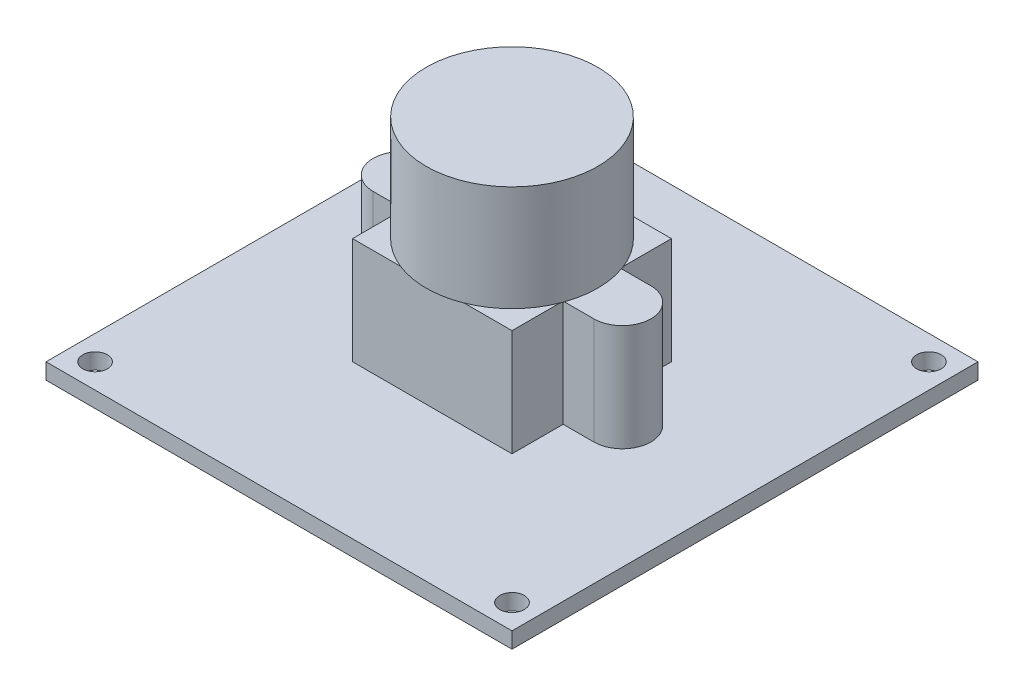
ISO-10303-21;
HEADER;
FILE_DESCRIPTION(('STEP AP214'),'2;1');
FILE_NAME('part.step','',(''),(''),'','','');
FILE_SCHEMA(('AUTOMOTIVE_DESIGN { 1 0 10303 214 1 1 1 1 }'));
ENDSEC;
DATA;
#1=APPLICATION_CONTEXT('core data for automotive mechanical design processes');
#2=APPLICATION_PROTOCOL_DEFINITION('international standard','automotive_design',2000,#1);
#3=PRODUCT_CONTEXT('',#1,'mechanical');
#4=PRODUCT('Part','Part','',(#3));
#5=PRODUCT_RELATED_PRODUCT_CATEGORY('part','',(#4));
#6=PRODUCT_DEFINITION_FORMATION('','',#4);
#7=PRODUCT_DEFINITION_CONTEXT('part definition',#1,'design');
#8=PRODUCT_DEFINITION('design','',#6,#7);
#9=PRODUCT_DEFINITION_SHAPE('','',#8);
#10=(LENGTH_UNIT() NAMED_UNIT(*) SI_UNIT(.MILLI.,.METRE.));
#11=(NAMED_UNIT(*) PLANE_ANGLE_UNIT() SI_UNIT($,.RADIAN.));
#12=(NAMED_UNIT(*) SI_UNIT($,.STERADIAN.) SOLID_ANGLE_UNIT());
#13=UNCERTAINTY_MEASURE_WITH_UNIT(LENGTH_MEASURE(1.E-05),#10,'distance_accuracy_value','');
#14=(GEOMETRIC_REPRESENTATION_CONTEXT(3) GLOBAL_UNCERTAINTY_ASSIGNED_CONTEXT((#13)) GLOBAL_UNIT_ASSIGNED_CONTEXT((#10,
#11,#12)) REPRESENTATION_CONTEXT('',''));
#15=CARTESIAN_POINT('',(0.,0.,0.));
#16=DIRECTION('',(0.,0.,1.));
#17=DIRECTION('',(1.,0.,0.));
#18=AXIS2_PLACEMENT_3D('',#15,#16,#17);
#19=CARTESIAN_POINT('',(-4.38653846154582,10.,5.00576923076923));
#20=DIRECTION('',(0.,1.,0.));
#21=DIRECTION('',(0.,0.,1.));
#22=AXIS2_PLACEMENT_3D('',#19,#20,#21);
#23=PLANE('',#22);
#24=CARTESIAN_POINT('',(4.61346153845418,10.,5.00576923076923));
#25=DIRECTION('',(0.,1.,0.));
#26=DIRECTION('',(0.,0.,1.));
#27=AXIS2_PLACEMENT_3D('',#24,#25,#26);
#28=CIRCLE('',#27,7.);
#29=CARTESIAN_POINT('',(7.2115377498075,10.,11.5057692307692));
#30=VERTEX_POINT('',#29);
#31=CARTESIAN_POINT('',(11.1134615384542,10.,7.60384544212255));
#32=VERTEX_POINT('',#31);
#33=EDGE_CURVE('E232',#30,#32,#28,.T.);
#34=ORIENTED_EDGE('',*,*,#33,.F.);
#35=DIRECTION('',(1.,0.,0.));
#36=VECTOR('',#35,1.);
#37=CARTESIAN_POINT('',(-1.88653846154583,10.,11.5057692307692));
#38=LINE('',#37,#36);
#39=CARTESIAN_POINT('',(11.1134615384542,10.,11.5057692307692));
#40=VERTEX_POINT('',#39);
#41=EDGE_CURVE('E217',#30,#40,#38,.T.);
#42=ORIENTED_EDGE('',*,*,#41,.T.);
#43=DIRECTION('',(0.,0.,-1.));
#44=VECTOR('',#43,1.);
#45=CARTESIAN_POINT('',(11.1134615384542,10.,11.5057692307692));
#46=LINE('',#45,#44);
#47=EDGE_CURVE('E308',#40,#32,#46,.T.);
#48=ORIENTED_EDGE('',*,*,#47,.T.);
#49=EDGE_LOOP('',(#34,#42,#48));
#50=FACE_BOUND('',#49,.T.);
#51=ADVANCED_FACE('F52',(#50),#23,.T.);
#52=CARTESIAN_POINT('',(11.2150175404706,10.,7.3337422444104));
#53=VERTEX_POINT('',#52);
#54=CARTESIAN_POINT('',(11.2150175404706,10.,2.67779621712805));
#55=VERTEX_POINT('',#54);
#56=EDGE_CURVE('E13',#53,#55,#28,.T.);
#57=ORIENTED_EDGE('',*,*,#56,.F.);
#58=DIRECTION('',(1.,0.,0.));
#59=VECTOR('',#58,1.);
#60=CARTESIAN_POINT('',(11.1134615384542,10.,7.3337422444104));
#61=LINE('',#60,#59);
#62=CARTESIAN_POINT('',(13.6134615384542,10.,7.3337422444104));
#63=VERTEX_POINT('',#62);
#64=EDGE_CURVE('E312',#53,#63,#61,.T.);
#65=ORIENTED_EDGE('',*,*,#64,.T.);
#66=CARTESIAN_POINT('',(13.6134615384542,10.,5.00576923076922));
#67=DIRECTION('',(0.,1.,0.));
#68=DIRECTION('',(0.,0.,1.));
#69=AXIS2_PLACEMENT_3D('',#66,#67,#68);
#70=CIRCLE('',#69,2.32797301364118);
#71=CARTESIAN_POINT('',(13.6134615384542,10.,2.67779621712805));
#72=VERTEX_POINT('',#71);
#73=EDGE_CURVE('E317',#63,#72,#70,.T.);
#74=ORIENTED_EDGE('',*,*,#73,.T.);
#75=DIRECTION('',(-1.,0.,0.));
#76=VECTOR('',#75,1.);
#77=CARTESIAN_POINT('',(11.1134615384542,10.,2.67779621712805));
#78=LINE('',#77,#76);
#79=EDGE_CURVE('E320',#72,#55,#78,.T.);
#80=ORIENTED_EDGE('',*,*,#79,.T.);
#81=EDGE_LOOP('',(#57,#65,#74,#80));
#82=FACE_BOUND('',#81,.T.);
#83=ADVANCED_FACE('F503',(#82),#23,.T.);
#84=CARTESIAN_POINT('',(11.1134615384542,10.,2.40769301941591));
#85=VERTEX_POINT('',#84);
#86=CARTESIAN_POINT('',(7.2115377498075,10.,-1.49423076923078));
#87=VERTEX_POINT('',#86);
#88=EDGE_CURVE('E62',#85,#87,#28,.T.);
#89=ORIENTED_EDGE('',*,*,#88,.F.);
#90=DIRECTION('',(0.,0.,-1.));
#91=VECTOR('',#90,1.);
#92=CARTESIAN_POINT('',(11.1134615384542,10.,2.67779621712805));
#93=LINE('',#92,#91);
#94=CARTESIAN_POINT('',(11.1134615384542,10.,-1.49423076923078));
#95=VERTEX_POINT('',#94);
#96=EDGE_CURVE('E361',#85,#95,#93,.T.);
#97=ORIENTED_EDGE('',*,*,#96,.T.);
#98=DIRECTION('',(-1.,0.,0.));
#99=VECTOR('',#98,1.);
#100=CARTESIAN_POINT('',(-1.88653846154583,10.,-1.49423076923078));
#101=LINE('',#100,#99);
#102=EDGE_CURVE('E613',#95,#87,#101,.T.);
#103=ORIENTED_EDGE('',*,*,#102,.T.);
#104=EDGE_LOOP('',(#89,#97,#103));
#105=FACE_BOUND('',#104,.T.);
#106=ADVANCED_FACE('F509',(#105),#23,.T.);
#107=CARTESIAN_POINT('',(2.01538532710086,10.,-1.49423076923078));
#108=VERTEX_POINT('',#107);
#109=CARTESIAN_POINT('',(-1.88653846154583,10.,2.40769301941591));
#110=VERTEX_POINT('',#109);
#111=EDGE_CURVE('E242',#108,#110,#28,.T.);
#112=ORIENTED_EDGE('',*,*,#111,.F.);
#113=CARTESIAN_POINT('',(-1.88653846154583,10.,-1.49423076923078));
#114=VERTEX_POINT('',#113);
#115=EDGE_CURVE('E608',#108,#114,#101,.T.);
#116=ORIENTED_EDGE('',*,*,#115,.T.);
#117=DIRECTION('',(0.,0.,1.));
#118=VECTOR('',#117,1.);
#119=CARTESIAN_POINT('',(-1.88653846154583,10.,2.67779621712805));
#120=LINE('',#119,#118);
#121=EDGE_CURVE('E296',#114,#110,#120,.T.);
#122=ORIENTED_EDGE('',*,*,#121,.T.);
#123=EDGE_LOOP('',(#112,#116,#122));
#124=FACE_BOUND('',#123,.T.);
#125=ADVANCED_FACE('F525',(#124),#23,.T.);
#126=CARTESIAN_POINT('',(-1.9880944635622,10.,2.67779621712805));
#127=VERTEX_POINT('',#126);
#128=CARTESIAN_POINT('',(-1.9880944635622,10.,7.3337422444104));
#129=VERTEX_POINT('',#128);
#130=EDGE_CURVE('E238',#127,#129,#28,.T.);
#131=ORIENTED_EDGE('',*,*,#130,.F.);
#132=DIRECTION('',(-1.,0.,0.));
#133=VECTOR('',#132,1.);
#134=CARTESIAN_POINT('',(-4.38653846154583,10.,2.67779621712805));
#135=LINE('',#134,#133);
#136=CARTESIAN_POINT('',(-4.38653846154583,10.,2.67779621712805));
#137=VERTEX_POINT('',#136);
#138=EDGE_CURVE('E289',#127,#137,#135,.T.);
#139=ORIENTED_EDGE('',*,*,#138,.T.);
#140=CARTESIAN_POINT('',(-4.38653846154582,10.,5.00576923076923));
#141=DIRECTION('',(0.,1.,0.));
#142=DIRECTION('',(0.,0.,1.));
#143=AXIS2_PLACEMENT_3D('',#140,#141,#142);
#144=CIRCLE('',#143,2.32797301364118);
#145=CARTESIAN_POINT('',(-4.38653846154582,10.,7.33374224441041));
#146=VERTEX_POINT('',#145);
#147=EDGE_CURVE('E288',#137,#146,#144,.T.);
#148=ORIENTED_EDGE('',*,*,#147,.T.);
#149=DIRECTION('',(1.,0.,0.));
#150=VECTOR('',#149,1.);
#151=CARTESIAN_POINT('',(-4.38653846154582,10.,7.33374224441041));
#152=LINE('',#151,#150);
#153=EDGE_CURVE('E300',#146,#129,#152,.T.);
#154=ORIENTED_EDGE('',*,*,#153,.T.);
#155=EDGE_LOOP('',(#131,#139,#148,#154));
#156=FACE_BOUND('',#155,.T.);
#157=ADVANCED_FACE('F515',(#156),#23,.T.);
#158=CARTESIAN_POINT('',(0.,1.3,0.));
#159=DIRECTION('',(0.,1.,0.));
#160=DIRECTION('',(0.,0.,1.));
#161=AXIS2_PLACEMENT_3D('',#158,#159,#160);
#162=PLANE('',#161);
#163=CARTESIAN_POINT('',(21.6134615384542,1.3,22.0057692307663));
#164=DIRECTION('',(0.,1.,0.));
#165=DIRECTION('',(0.,0.,1.));
#166=AXIS2_PLACEMENT_3D('',#163,#164,#165);
#167=CIRCLE('',#166,1.);
#168=CARTESIAN_POINT('',(21.6134615384542,1.3,23.0057692307663));
#169=VERTEX_POINT('',#168);
#170=EDGE_CURVE('E414',#169,#169,#167,.T.);
#171=ORIENTED_EDGE('',*,*,#170,.F.);
#172=EDGE_LOOP('',(#171));
#173=FACE_BOUND('',#172,.T.);
#174=CARTESIAN_POINT('',(-12.3865384615458,1.3,-11.9942307692338));
#175=DIRECTION('',(0.,1.,0.));
#176=DIRECTION('',(0.,0.,1.));
#177=AXIS2_PLACEMENT_3D('',#174,#175,#176);
#178=CIRCLE('',#177,1.);
#179=CARTESIAN_POINT('',(-12.3865384615458,1.3,-10.9942307692338));
#180=VERTEX_POINT('',#179);
#181=EDGE_CURVE('E430',#180,#180,#178,.T.);
#182=ORIENTED_EDGE('',*,*,#181,.F.);
#183=EDGE_LOOP('',(#182));
#184=FACE_BOUND('',#183,.T.);
#185=DIRECTION('',(0.,0.,1.));
#186=VECTOR('',#185,1.);
#187=CARTESIAN_POINT('',(-14.3865384615458,1.3,-13.9942307692308));
#188=LINE('',#187,#186);
#189=CARTESIAN_POINT('',(-14.3865384615458,1.3,-13.9942307692308));
#190=VERTEX_POINT('',#189);
#191=CARTESIAN_POINT('',(-14.3865384615458,1.3,24.0057692307692));
#192=VERTEX_POINT('',#191);
#193=EDGE_CURVE('E438',#190,#192,#188,.T.);
#194=ORIENTED_EDGE('',*,*,#193,.T.);
#195=DIRECTION('',(1.,0.,0.));
#196=VECTOR('',#195,1.);
#197=CARTESIAN_POINT('',(-14.3865384615458,1.3,24.0057692307692));
#198=LINE('',#197,#196);
#199=CARTESIAN_POINT('',(23.6134615384542,1.3,24.0057692307692));
#200=VERTEX_POINT('',#199);
#201=EDGE_CURVE('E442',#192,#200,#198,.T.);
#202=ORIENTED_EDGE('',*,*,#201,.T.);
#203=DIRECTION('',(0.,0.,-1.));
#204=VECTOR('',#203,1.);
#205=CARTESIAN_POINT('',(23.6134615384542,1.3,-13.9942307692308));
#206=LINE('',#205,#204);
#207=CARTESIAN_POINT('',(23.6134615384542,1.3,-13.9942307692308));
#208=VERTEX_POINT('',#207);
#209=EDGE_CURVE('E446',#200,#208,#206,.T.);
#210=ORIENTED_EDGE('',*,*,#209,.T.);
#211=DIRECTION('',(-1.,0.,0.));
#212=VECTOR('',#211,1.);
#213=CARTESIAN_POINT('',(-14.3865384615458,1.3,-13.9942307692308));
#214=LINE('',#213,#212);
#215=EDGE_CURVE('E449',#208,#190,#214,.T.);
#216=ORIENTED_EDGE('',*,*,#215,.T.);
#217=EDGE_LOOP('',(#194,#202,#210,#216));
#218=FACE_BOUND('',#217,.T.);
#219=CARTESIAN_POINT('',(21.6134615384542,1.3,-11.9942307692338));
#220=DIRECTION('',(0.,1.,0.));
#221=DIRECTION('',(0.,0.,1.));
#222=AXIS2_PLACEMENT_3D('',#219,#220,#221);
#223=CIRCLE('',#222,1.);
#224=CARTESIAN_POINT('',(21.6134615384542,1.3,-10.9942307692338));
#225=VERTEX_POINT('',#224);
#226=EDGE_CURVE('E422',#225,#225,#223,.T.);
#227=ORIENTED_EDGE('',*,*,#226,.F.);
#228=EDGE_LOOP('',(#227));
#229=FACE_BOUND('',#228,.T.);
#230=CARTESIAN_POINT('',(-12.3865384615458,1.3,22.0057692307662));
#231=DIRECTION('',(0.,1.,0.));
#232=DIRECTION('',(0.,0.,1.));
#233=AXIS2_PLACEMENT_3D('',#230,#231,#232);
#234=CIRCLE('',#233,1.);
#235=CARTESIAN_POINT('',(-12.3865384615458,1.3,23.0057692307662));
#236=VERTEX_POINT('',#235);
#237=EDGE_CURVE('E406',#236,#236,#234,.T.);
#238=ORIENTED_EDGE('',*,*,#237,.F.);
#239=EDGE_LOOP('',(#238));
#240=FACE_BOUND('',#239,.T.);
#241=DIRECTION('',(-1.,0.,0.));
#242=VECTOR('',#241,1.);
#243=CARTESIAN_POINT('',(-1.88653846154583,1.3,-1.49423076923078));
#244=LINE('',#243,#242);
#245=CARTESIAN_POINT('',(11.1134615384542,1.3,-1.49423076923078));
#246=VERTEX_POINT('',#245);
#247=CARTESIAN_POINT('',(-1.88653846154583,1.3,-1.49423076923078));
#248=VERTEX_POINT('',#247);
#249=EDGE_CURVE('E327',#246,#248,#244,.T.);
#250=ORIENTED_EDGE('',*,*,#249,.F.);
#251=DIRECTION('',(0.,0.,-1.));
#252=VECTOR('',#251,1.);
#253=CARTESIAN_POINT('',(11.1134615384542,1.3,2.67779621712805));
#254=LINE('',#253,#252);
#255=CARTESIAN_POINT('',(11.1134615384542,1.3,2.67779621712805));
#256=VERTEX_POINT('',#255);
#257=EDGE_CURVE('E254',#256,#246,#254,.T.);
#258=ORIENTED_EDGE('',*,*,#257,.F.);
#259=DIRECTION('',(-1.,0.,0.));
#260=VECTOR('',#259,1.);
#261=CARTESIAN_POINT('',(11.1134615384542,1.3,2.67779621712805));
#262=LINE('',#261,#260);
#263=CARTESIAN_POINT('',(13.6134615384542,1.3,2.67779621712804));
#264=VERTEX_POINT('',#263);
#265=EDGE_CURVE('E358',#264,#256,#262,.T.);
#266=ORIENTED_EDGE('',*,*,#265,.F.);
#267=CARTESIAN_POINT('',(13.6134615384542,1.3,5.00576923076922));
#268=DIRECTION('',(0.,1.,0.));
#269=DIRECTION('',(0.,0.,1.));
#270=AXIS2_PLACEMENT_3D('',#267,#268,#269);
#271=CIRCLE('',#270,2.32797301364118);
#272=CARTESIAN_POINT('',(13.6134615384542,1.3,7.3337422444104));
#273=VERTEX_POINT('',#272);
#274=EDGE_CURVE('E354',#273,#264,#271,.T.);
#275=ORIENTED_EDGE('',*,*,#274,.F.);
#276=DIRECTION('',(1.,0.,0.));
#277=VECTOR('',#276,1.);
#278=CARTESIAN_POINT('',(11.1134615384542,1.3,7.3337422444104));
#279=LINE('',#278,#277);
#280=CARTESIAN_POINT('',(11.1134615384542,1.3,7.3337422444104));
#281=VERTEX_POINT('',#280);
#282=EDGE_CURVE('E351',#281,#273,#279,.T.);
#283=ORIENTED_EDGE('',*,*,#282,.F.);
#284=DIRECTION('',(0.,0.,-1.));
#285=VECTOR('',#284,1.);
#286=CARTESIAN_POINT('',(11.1134615384542,1.3,11.5057692307692));
#287=LINE('',#286,#285);
#288=CARTESIAN_POINT('',(11.1134615384542,1.3,11.5057692307692));
#289=VERTEX_POINT('',#288);
#290=EDGE_CURVE('E348',#289,#281,#287,.T.);
#291=ORIENTED_EDGE('',*,*,#290,.F.);
#292=DIRECTION('',(1.,0.,0.));
#293=VECTOR('',#292,1.);
#294=CARTESIAN_POINT('',(-1.88653846154583,1.3,11.5057692307692));
#295=LINE('',#294,#293);
#296=CARTESIAN_POINT('',(-1.88653846154583,1.3,11.5057692307692));
#297=VERTEX_POINT('',#296);
#298=EDGE_CURVE('E345',#297,#289,#295,.T.);
#299=ORIENTED_EDGE('',*,*,#298,.F.);
#300=DIRECTION('',(0.,0.,1.));
#301=VECTOR('',#300,1.);
#302=CARTESIAN_POINT('',(-1.88653846154583,1.3,11.5057692307692));
#303=LINE('',#302,#301);
#304=CARTESIAN_POINT('',(-1.88653846154583,1.3,7.3337422444104));
#305=VERTEX_POINT('',#304);
#306=EDGE_CURVE('E342',#305,#297,#303,.T.);
#307=ORIENTED_EDGE('',*,*,#306,.F.);
#308=DIRECTION('',(1.,0.,0.));
#309=VECTOR('',#308,1.);
#310=CARTESIAN_POINT('',(-4.38653846154582,1.3,7.33374224441041));
#311=LINE('',#310,#309);
#312=CARTESIAN_POINT('',(-4.38653846154582,1.3,7.33374224441041));
#313=VERTEX_POINT('',#312);
#314=EDGE_CURVE('E339',#313,#305,#311,.T.);
#315=ORIENTED_EDGE('',*,*,#314,.F.);
#316=CARTESIAN_POINT('',(-4.38653846154582,1.3,5.00576923076923));
#317=DIRECTION('',(0.,1.,0.));
#318=DIRECTION('',(0.,0.,1.));
#319=AXIS2_PLACEMENT_3D('',#316,#317,#318);
#320=CIRCLE('',#319,2.32797301364118);
#321=CARTESIAN_POINT('',(-4.38653846154583,1.3,2.67779621712805));
#322=VERTEX_POINT('',#321);
#323=EDGE_CURVE('E336',#322,#313,#320,.T.);
#324=ORIENTED_EDGE('',*,*,#323,.F.);
#325=DIRECTION('',(-1.,0.,0.));
#326=VECTOR('',#325,1.);
#327=CARTESIAN_POINT('',(-4.38653846154583,1.3,2.67779621712805));
#328=LINE('',#327,#326);
#329=CARTESIAN_POINT('',(-1.88653846154583,1.3,2.67779621712805));
#330=VERTEX_POINT('',#329);
#331=EDGE_CURVE('E333',#330,#322,#328,.T.);
#332=ORIENTED_EDGE('',*,*,#331,.F.);
#333=DIRECTION('',(0.,0.,1.));
#334=VECTOR('',#333,1.);
#335=CARTESIAN_POINT('',(-1.88653846154583,1.3,2.67779621712805));
#336=LINE('',#335,#334);
#337=EDGE_CURVE('E330',#248,#330,#336,.T.);
#338=ORIENTED_EDGE('',*,*,#337,.F.);
#339=EDGE_LOOP('',(#250,#258,#266,#275,#283,#291,#299,#307,#315,#324,#332,#338));
#340=FACE_BOUND('',#339,.T.);
#341=ADVANCED_FACE('F493',(#173,#184,#218,#229,#240,#340),#162,.T.);
#342=CARTESIAN_POINT('',(0.,0.,0.));
#343=DIRECTION('',(0.,1.,0.));
#344=DIRECTION('',(0.,0.,1.));
#345=AXIS2_PLACEMENT_3D('',#342,#343,#344);
#346=PLANE('',#345);
#347=DIRECTION('',(0.,0.,1.));
#348=VECTOR('',#347,1.);
#349=CARTESIAN_POINT('',(-14.3865384615458,0.,-13.9942307692308));
#350=LINE('',#349,#348);
#351=CARTESIAN_POINT('',(-14.3865384615458,0.,-13.9942307692308));
#352=VERTEX_POINT('',#351);
#353=CARTESIAN_POINT('',(-14.3865384615458,0.,24.0057692307692));
#354=VERTEX_POINT('',#353);
#355=EDGE_CURVE('E434',#352,#354,#350,.T.);
#356=ORIENTED_EDGE('',*,*,#355,.F.);
#357=DIRECTION('',(-1.,0.,0.));
#358=VECTOR('',#357,1.);
#359=CARTESIAN_POINT('',(-14.3865384615458,0.,-13.9942307692308));
#360=LINE('',#359,#358);
#361=CARTESIAN_POINT('',(23.6134615384542,0.,-13.9942307692308));
#362=VERTEX_POINT('',#361);
#363=EDGE_CURVE('E443',#362,#352,#360,.T.);
#364=ORIENTED_EDGE('',*,*,#363,.F.);
#365=DIRECTION('',(0.,0.,-1.));
#366=VECTOR('',#365,1.);
#367=CARTESIAN_POINT('',(23.6134615384542,0.,-13.9942307692308));
#368=LINE('',#367,#366);
#369=CARTESIAN_POINT('',(23.6134615384542,0.,24.0057692307692));
#370=VERTEX_POINT('',#369);
#371=EDGE_CURVE('E459',#370,#362,#368,.T.);
#372=ORIENTED_EDGE('',*,*,#371,.F.);
#373=DIRECTION('',(1.,0.,0.));
#374=VECTOR('',#373,1.);
#375=CARTESIAN_POINT('',(-14.3865384615458,0.,24.0057692307692));
#376=LINE('',#375,#374);
#377=EDGE_CURVE('E456',#354,#370,#376,.T.);
#378=ORIENTED_EDGE('',*,*,#377,.F.);
#379=EDGE_LOOP('',(#356,#364,#372,#378));
#380=FACE_BOUND('',#379,.T.);
#381=CARTESIAN_POINT('',(-12.3865384615458,0.,-11.9942307692338));
#382=DIRECTION('',(0.,1.,0.));
#383=DIRECTION('',(0.,0.,1.));
#384=AXIS2_PLACEMENT_3D('',#381,#382,#383);
#385=CIRCLE('',#384,1.);
#386=CARTESIAN_POINT('',(-12.3865384615458,0.,-10.9942307692338));
#387=VERTEX_POINT('',#386);
#388=EDGE_CURVE('E426',#387,#387,#385,.T.);
#389=ORIENTED_EDGE('',*,*,#388,.T.);
#390=EDGE_LOOP('',(#389));
#391=FACE_BOUND('',#390,.T.);
#392=CARTESIAN_POINT('',(21.6134615384542,0.,-11.9942307692338));
#393=DIRECTION('',(0.,1.,0.));
#394=DIRECTION('',(0.,0.,1.));
#395=AXIS2_PLACEMENT_3D('',#392,#393,#394);
#396=CIRCLE('',#395,1.);
#397=CARTESIAN_POINT('',(21.6134615384542,0.,-10.9942307692338));
#398=VERTEX_POINT('',#397);
#399=EDGE_CURVE('E418',#398,#398,#396,.T.);
#400=ORIENTED_EDGE('',*,*,#399,.T.);
#401=EDGE_LOOP('',(#400));
#402=FACE_BOUND('',#401,.T.);
#403=CARTESIAN_POINT('',(21.6134615384542,0.,22.0057692307663));
#404=DIRECTION('',(0.,1.,0.));
#405=DIRECTION('',(0.,0.,1.));
#406=AXIS2_PLACEMENT_3D('',#403,#404,#405);
#407=CIRCLE('',#406,1.);
#408=CARTESIAN_POINT('',(21.6134615384542,0.,23.0057692307663));
#409=VERTEX_POINT('',#408);
#410=EDGE_CURVE('E410',#409,#409,#407,.T.);
#411=ORIENTED_EDGE('',*,*,#410,.T.);
#412=EDGE_LOOP('',(#411));
#413=FACE_BOUND('',#412,.T.);
#414=CARTESIAN_POINT('',(-12.3865384615458,0.,22.0057692307662));
#415=DIRECTION('',(0.,1.,0.));
#416=DIRECTION('',(0.,0.,1.));
#417=AXIS2_PLACEMENT_3D('',#414,#415,#416);
#418=CIRCLE('',#417,1.);
#419=CARTESIAN_POINT('',(-12.3865384615458,0.,23.0057692307662));
#420=VERTEX_POINT('',#419);
#421=EDGE_CURVE('E405',#420,#420,#418,.T.);
#422=ORIENTED_EDGE('',*,*,#421,.T.);
#423=EDGE_LOOP('',(#422));
#424=FACE_BOUND('',#423,.T.);
#425=ADVANCED_FACE('F483',(#380,#391,#402,#413,#424),#346,.F.);
#426=CARTESIAN_POINT('',(-14.3865384615458,1.3,-13.9942307692308));
#427=DIRECTION('',(1.,0.,0.));
#428=DIRECTION('',(0.,0.,-1.));
#429=AXIS2_PLACEMENT_3D('',#426,#427,#428);
#430=PLANE('',#429);
#431=ORIENTED_EDGE('',*,*,#355,.T.);
#432=DIRECTION('',(0.,-1.,0.));
#433=VECTOR('',#432,1.);
#434=CARTESIAN_POINT('',(-14.3865384615458,1.3,24.0057692307692));
#435=LINE('',#434,#433);
#436=EDGE_CURVE('E56',#192,#354,#435,.T.);
#437=ORIENTED_EDGE('',*,*,#436,.F.);
#438=ORIENTED_EDGE('',*,*,#193,.F.);
#439=DIRECTION('',(0.,-1.,0.));
#440=VECTOR('',#439,1.);
#441=CARTESIAN_POINT('',(-14.3865384615458,1.3,-13.9942307692308));
#442=LINE('',#441,#440);
#443=EDGE_CURVE('E452',#190,#352,#442,.T.);
#444=ORIENTED_EDGE('',*,*,#443,.T.);
#445=EDGE_LOOP('',(#431,#437,#438,#444));
#446=FACE_BOUND('',#445,.T.);
#447=ADVANCED_FACE('F54',(#446),#430,.F.);
#448=CARTESIAN_POINT('',(-14.3865384615458,1.3,24.0057692307692));
#449=DIRECTION('',(0.,0.,-1.));
#450=DIRECTION('',(-1.,0.,0.));
#451=AXIS2_PLACEMENT_3D('',#448,#449,#450);
#452=PLANE('',#451);
#453=ORIENTED_EDGE('',*,*,#377,.T.);
#454=DIRECTION('',(0.,-1.,0.));
#455=VECTOR('',#454,1.);
#456=CARTESIAN_POINT('',(23.6134615384542,1.3,24.0057692307692));
#457=LINE('',#456,#455);
#458=EDGE_CURVE('E244',#200,#370,#457,.T.);
#459=ORIENTED_EDGE('',*,*,#458,.F.);
#460=ORIENTED_EDGE('',*,*,#201,.F.);
#461=ORIENTED_EDGE('',*,*,#436,.T.);
#462=EDGE_LOOP('',(#453,#459,#460,#461));
#463=FACE_BOUND('',#462,.T.);
#464=ADVANCED_FACE('F495',(#463),#452,.F.);
#465=CARTESIAN_POINT('',(23.6134615384542,1.3,-13.9942307692308));
#466=DIRECTION('',(-1.,0.,0.));
#467=DIRECTION('',(0.,0.,1.));
#468=AXIS2_PLACEMENT_3D('',#465,#466,#467);
#469=PLANE('',#468);
#470=ORIENTED_EDGE('',*,*,#371,.T.);
#471=DIRECTION('',(0.,-1.,0.));
#472=VECTOR('',#471,1.);
#473=CARTESIAN_POINT('',(23.6134615384542,1.3,-13.9942307692308));
#474=LINE('',#473,#472);
#475=EDGE_CURVE('E467',#208,#362,#474,.T.);
#476=ORIENTED_EDGE('',*,*,#475,.F.);
#477=ORIENTED_EDGE('',*,*,#209,.F.);
#478=ORIENTED_EDGE('',*,*,#458,.T.);
#479=EDGE_LOOP('',(#470,#476,#477,#478));
#480=FACE_BOUND('',#479,.T.);
#481=ADVANCED_FACE('F477',(#480),#469,.F.);
#482=CARTESIAN_POINT('',(-14.3865384615458,1.3,-13.9942307692308));
#483=DIRECTION('',(0.,0.,1.));
#484=DIRECTION('',(1.,0.,0.));
#485=AXIS2_PLACEMENT_3D('',#482,#483,#484);
#486=PLANE('',#485);
#487=ORIENTED_EDGE('',*,*,#363,.T.);
#488=ORIENTED_EDGE('',*,*,#443,.F.);
#489=ORIENTED_EDGE('',*,*,#215,.F.);
#490=ORIENTED_EDGE('',*,*,#475,.T.);
#491=EDGE_LOOP('',(#487,#488,#489,#490));
#492=FACE_BOUND('',#491,.T.);
#493=ADVANCED_FACE('F487',(#492),#486,.F.);
#494=CARTESIAN_POINT('',(-12.3865384615458,1.3,-11.9942307692338));
#495=DIRECTION('',(0.,-1.,0.));
#496=DIRECTION('',(0.,0.,-1.));
#497=AXIS2_PLACEMENT_3D('',#494,#495,#496);
#498=CYLINDRICAL_SURFACE('',#497,1.);
#499=ORIENTED_EDGE('',*,*,#181,.T.);
#500=EDGE_LOOP('',(#499));
#501=FACE_BOUND('',#500,.T.);
#502=ORIENTED_EDGE('',*,*,#388,.F.);
#503=EDGE_LOOP('',(#502));
#504=FACE_BOUND('',#503,.T.);
#505=ADVANCED_FACE('F717',(#501,#504),#498,.F.);
#506=CARTESIAN_POINT('',(21.6134615384542,1.3,-11.9942307692338));
#507=DIRECTION('',(0.,-1.,0.));
#508=DIRECTION('',(0.,0.,-1.));
#509=AXIS2_PLACEMENT_3D('',#506,#507,#508);
#510=CYLINDRICAL_SURFACE('',#509,1.);
#511=ORIENTED_EDGE('',*,*,#226,.T.);
#512=EDGE_LOOP('',(#511));
#513=FACE_BOUND('',#512,.T.);
#514=ORIENTED_EDGE('',*,*,#399,.F.);
#515=EDGE_LOOP('',(#514));
#516=FACE_BOUND('',#515,.T.);
#517=ADVANCED_FACE('F713',(#513,#516),#510,.F.);
#518=CARTESIAN_POINT('',(21.6134615384542,1.3,22.0057692307663));
#519=DIRECTION('',(0.,-1.,0.));
#520=DIRECTION('',(0.,0.,-1.));
#521=AXIS2_PLACEMENT_3D('',#518,#519,#520);
#522=CYLINDRICAL_SURFACE('',#521,1.);
#523=ORIENTED_EDGE('',*,*,#170,.T.);
#524=EDGE_LOOP('',(#523));
#525=FACE_BOUND('',#524,.T.);
#526=ORIENTED_EDGE('',*,*,#410,.F.);
#527=EDGE_LOOP('',(#526));
#528=FACE_BOUND('',#527,.T.);
#529=ADVANCED_FACE('F709',(#525,#528),#522,.F.);
#530=CARTESIAN_POINT('',(-12.3865384615458,1.3,22.0057692307662));
#531=DIRECTION('',(0.,-1.,0.));
#532=DIRECTION('',(0.,0.,-1.));
#533=AXIS2_PLACEMENT_3D('',#530,#531,#532);
#534=CYLINDRICAL_SURFACE('',#533,1.);
#535=ORIENTED_EDGE('',*,*,#237,.T.);
#536=EDGE_LOOP('',(#535));
#537=FACE_BOUND('',#536,.T.);
#538=ORIENTED_EDGE('',*,*,#421,.F.);
#539=EDGE_LOOP('',(#538));
#540=FACE_BOUND('',#539,.T.);
#541=ADVANCED_FACE('F706',(#537,#540),#534,.F.);
#542=CARTESIAN_POINT('',(11.1134615384542,10.,2.67779621712805));
#543=DIRECTION('',(-1.,0.,0.));
#544=DIRECTION('',(0.,0.,1.));
#545=AXIS2_PLACEMENT_3D('',#542,#543,#544);
#546=PLANE('',#545);
#547=ORIENTED_EDGE('',*,*,#257,.T.);
#548=DIRECTION('',(0.,-1.,0.));
#549=VECTOR('',#548,1.);
#550=CARTESIAN_POINT('',(11.1134615384542,10.,-1.49423076923078));
#551=LINE('',#550,#549);
#552=EDGE_CURVE('E402',#95,#246,#551,.T.);
#553=ORIENTED_EDGE('',*,*,#552,.F.);
#554=ORIENTED_EDGE('',*,*,#96,.F.);
#555=CARTESIAN_POINT('',(11.1134615384542,10.,2.67779621712805));
#556=VERTEX_POINT('',#555);
#557=EDGE_CURVE('E604',#556,#85,#93,.T.);
#558=ORIENTED_EDGE('',*,*,#557,.F.);
#559=DIRECTION('',(0.,-1.,0.));
#560=VECTOR('',#559,1.);
#561=CARTESIAN_POINT('',(11.1134615384542,10.,2.67779621712805));
#562=LINE('',#561,#560);
#563=EDGE_CURVE('E323',#556,#256,#562,.T.);
#564=ORIENTED_EDGE('',*,*,#563,.T.);
#565=EDGE_LOOP('',(#547,#553,#554,#558,#564));
#566=FACE_BOUND('',#565,.T.);
#567=ADVANCED_FACE('F634',(#566),#546,.F.);
#568=CARTESIAN_POINT('',(-1.88653846154583,10.,-1.49423076923078));
#569=DIRECTION('',(0.,0.,1.));
#570=DIRECTION('',(1.,0.,0.));
#571=AXIS2_PLACEMENT_3D('',#568,#569,#570);
#572=PLANE('',#571);
#573=ORIENTED_EDGE('',*,*,#249,.T.);
#574=DIRECTION('',(0.,-1.,0.));
#575=VECTOR('',#574,1.);
#576=CARTESIAN_POINT('',(-1.88653846154583,10.,-1.49423076923078));
#577=LINE('',#576,#575);
#578=EDGE_CURVE('E398',#114,#248,#577,.T.);
#579=ORIENTED_EDGE('',*,*,#578,.F.);
#580=ORIENTED_EDGE('',*,*,#115,.F.);
#581=EDGE_CURVE('E612',#87,#108,#101,.T.);
#582=ORIENTED_EDGE('',*,*,#581,.F.);
#583=ORIENTED_EDGE('',*,*,#102,.F.);
#584=ORIENTED_EDGE('',*,*,#552,.T.);
#585=EDGE_LOOP('',(#573,#579,#580,#582,#583,#584));
#586=FACE_BOUND('',#585,.T.);
#587=ADVANCED_FACE('F625',(#586),#572,.F.);
#588=CARTESIAN_POINT('',(-1.88653846154583,10.,2.67779621712805));
#589=DIRECTION('',(1.,0.,0.));
#590=DIRECTION('',(0.,0.,-1.));
#591=AXIS2_PLACEMENT_3D('',#588,#589,#590);
#592=PLANE('',#591);
#593=ORIENTED_EDGE('',*,*,#337,.T.);
#594=DIRECTION('',(0.,-1.,0.));
#595=VECTOR('',#594,1.);
#596=CARTESIAN_POINT('',(-1.88653846154583,10.,2.67779621712805));
#597=LINE('',#596,#595);
#598=CARTESIAN_POINT('',(-1.88653846154583,10.,2.67779621712805));
#599=VERTEX_POINT('',#598);
#600=EDGE_CURVE('E395',#599,#330,#597,.T.);
#601=ORIENTED_EDGE('',*,*,#600,.F.);
#602=EDGE_CURVE('E281',#110,#599,#120,.T.);
#603=ORIENTED_EDGE('',*,*,#602,.F.);
#604=ORIENTED_EDGE('',*,*,#121,.F.);
#605=ORIENTED_EDGE('',*,*,#578,.T.);
#606=EDGE_LOOP('',(#593,#601,#603,#604,#605));
#607=FACE_BOUND('',#606,.T.);
#608=ADVANCED_FACE('F640',(#607),#592,.F.);
#609=CARTESIAN_POINT('',(-4.38653846154583,10.,2.67779621712805));
#610=DIRECTION('',(0.,0.,1.));
#611=DIRECTION('',(1.,0.,0.));
#612=AXIS2_PLACEMENT_3D('',#609,#610,#611);
#613=PLANE('',#612);
#614=ORIENTED_EDGE('',*,*,#331,.T.);
#615=DIRECTION('',(0.,-1.,0.));
#616=VECTOR('',#615,1.);
#617=CARTESIAN_POINT('',(-4.38653846154583,10.,2.67779621712805));
#618=LINE('',#617,#616);
#619=EDGE_CURVE('E391',#137,#322,#618,.T.);
#620=ORIENTED_EDGE('',*,*,#619,.F.);
#621=ORIENTED_EDGE('',*,*,#138,.F.);
#622=EDGE_CURVE('E283',#599,#127,#135,.T.);
#623=ORIENTED_EDGE('',*,*,#622,.F.);
#624=ORIENTED_EDGE('',*,*,#600,.T.);
#625=EDGE_LOOP('',(#614,#620,#621,#623,#624));
#626=FACE_BOUND('',#625,.T.);
#627=ADVANCED_FACE('F536',(#626),#613,.F.);
#628=CARTESIAN_POINT('',(-4.38653846154582,10.,5.00576923076923));
#629=DIRECTION('',(0.,-1.,0.));
#630=DIRECTION('',(0.,0.,-1.));
#631=AXIS2_PLACEMENT_3D('',#628,#629,#630);
#632=CYLINDRICAL_SURFACE('',#631,2.32797301364118);
#633=ORIENTED_EDGE('',*,*,#323,.T.);
#634=DIRECTION('',(0.,-1.,0.));
#635=VECTOR('',#634,1.);
#636=CARTESIAN_POINT('',(-4.38653846154582,10.,7.33374224441041));
#637=LINE('',#636,#635);
#638=EDGE_CURVE('E387',#146,#313,#637,.T.);
#639=ORIENTED_EDGE('',*,*,#638,.F.);
#640=ORIENTED_EDGE('',*,*,#147,.F.);
#641=ORIENTED_EDGE('',*,*,#619,.T.);
#642=EDGE_LOOP('',(#633,#639,#640,#641));
#643=FACE_BOUND('',#642,.T.);
#644=ADVANCED_FACE('F542',(#643),#632,.T.);
#645=CARTESIAN_POINT('',(-4.38653846154582,10.,7.33374224441041));
#646=DIRECTION('',(0.,0.,-1.));
#647=DIRECTION('',(-1.,0.,0.));
#648=AXIS2_PLACEMENT_3D('',#645,#646,#647);
#649=PLANE('',#648);
#650=ORIENTED_EDGE('',*,*,#314,.T.);
#651=DIRECTION('',(0.,-1.,0.));
#652=VECTOR('',#651,1.);
#653=CARTESIAN_POINT('',(-1.88653846154583,10.,7.3337422444104));
#654=LINE('',#653,#652);
#655=CARTESIAN_POINT('',(-1.88653846154583,10.,7.3337422444104));
#656=VERTEX_POINT('',#655);
#657=EDGE_CURVE('E383',#656,#305,#654,.T.);
#658=ORIENTED_EDGE('',*,*,#657,.F.);
#659=EDGE_CURVE('E294',#129,#656,#152,.T.);
#660=ORIENTED_EDGE('',*,*,#659,.F.);
#661=ORIENTED_EDGE('',*,*,#153,.F.);
#662=ORIENTED_EDGE('',*,*,#638,.T.);
#663=EDGE_LOOP('',(#650,#658,#660,#661,#662));
#664=FACE_BOUND('',#663,.T.);
#665=ADVANCED_FACE('F545',(#664),#649,.F.);
#666=CARTESIAN_POINT('',(-1.88653846154583,10.,11.5057692307692));
#667=DIRECTION('',(1.,0.,0.));
#668=DIRECTION('',(0.,0.,-1.));
#669=AXIS2_PLACEMENT_3D('',#666,#667,#668);
#670=PLANE('',#669);
#671=ORIENTED_EDGE('',*,*,#306,.T.);
#672=DIRECTION('',(0.,-1.,0.));
#673=VECTOR('',#672,1.);
#674=CARTESIAN_POINT('',(-1.88653846154583,10.,11.5057692307692));
#675=LINE('',#674,#673);
#676=CARTESIAN_POINT('',(-1.88653846154583,10.,11.5057692307692));
#677=VERTEX_POINT('',#676);
#678=EDGE_CURVE('E380',#677,#297,#675,.T.);
#679=ORIENTED_EDGE('',*,*,#678,.F.);
#680=DIRECTION('',(0.,0.,1.));
#681=VECTOR('',#680,1.);
#682=CARTESIAN_POINT('',(-1.88653846154583,10.,11.5057692307692));
#683=LINE('',#682,#681);
#684=CARTESIAN_POINT('',(-1.88653846154583,10.,7.60384544212254));
#685=VERTEX_POINT('',#684);
#686=EDGE_CURVE('E209',#685,#677,#683,.T.);
#687=ORIENTED_EDGE('',*,*,#686,.F.);
#688=EDGE_CURVE('E304',#656,#685,#683,.T.);
#689=ORIENTED_EDGE('',*,*,#688,.F.);
#690=ORIENTED_EDGE('',*,*,#657,.T.);
#691=EDGE_LOOP('',(#671,#679,#687,#689,#690));
#692=FACE_BOUND('',#691,.T.);
#693=ADVANCED_FACE('F644',(#692),#670,.F.);
#694=CARTESIAN_POINT('',(-1.88653846154583,10.,11.5057692307692));
#695=DIRECTION('',(0.,0.,-1.));
#696=DIRECTION('',(-1.,0.,0.));
#697=AXIS2_PLACEMENT_3D('',#694,#695,#696);
#698=PLANE('',#697);
#699=ORIENTED_EDGE('',*,*,#298,.T.);
#700=DIRECTION('',(0.,-1.,0.));
#701=VECTOR('',#700,1.);
#702=CARTESIAN_POINT('',(11.1134615384542,10.,11.5057692307692));
#703=LINE('',#702,#701);
#704=EDGE_CURVE('E376',#40,#289,#703,.T.);
#705=ORIENTED_EDGE('',*,*,#704,.F.);
#706=ORIENTED_EDGE('',*,*,#41,.F.);
#707=CARTESIAN_POINT('',(2.01538532710086,10.,11.5057692307692));
#708=VERTEX_POINT('',#707);
#709=EDGE_CURVE('E215',#708,#30,#38,.T.);
#710=ORIENTED_EDGE('',*,*,#709,.F.);
#711=EDGE_CURVE('E203',#677,#708,#38,.T.);
#712=ORIENTED_EDGE('',*,*,#711,.F.);
#713=ORIENTED_EDGE('',*,*,#678,.T.);
#714=EDGE_LOOP('',(#699,#705,#706,#710,#712,#713));
#715=FACE_BOUND('',#714,.T.);
#716=ADVANCED_FACE('F221',(#715),#698,.F.);
#717=CARTESIAN_POINT('',(11.1134615384542,10.,11.5057692307692));
#718=DIRECTION('',(-1.,0.,0.));
#719=DIRECTION('',(0.,0.,1.));
#720=AXIS2_PLACEMENT_3D('',#717,#718,#719);
#721=PLANE('',#720);
#722=ORIENTED_EDGE('',*,*,#290,.T.);
#723=DIRECTION('',(0.,-1.,0.));
#724=VECTOR('',#723,1.);
#725=CARTESIAN_POINT('',(11.1134615384542,10.,7.3337422444104));
#726=LINE('',#725,#724);
#727=CARTESIAN_POINT('',(11.1134615384542,10.,7.3337422444104));
#728=VERTEX_POINT('',#727);
#729=EDGE_CURVE('E372',#728,#281,#726,.T.);
#730=ORIENTED_EDGE('',*,*,#729,.F.);
#731=EDGE_CURVE('E214',#32,#728,#46,.T.);
#732=ORIENTED_EDGE('',*,*,#731,.F.);
#733=ORIENTED_EDGE('',*,*,#47,.F.);
#734=ORIENTED_EDGE('',*,*,#704,.T.);
#735=EDGE_LOOP('',(#722,#730,#732,#733,#734));
#736=FACE_BOUND('',#735,.T.);
#737=ADVANCED_FACE('F680',(#736),#721,.F.);
#738=CARTESIAN_POINT('',(11.1134615384542,10.,7.3337422444104));
#739=DIRECTION('',(0.,0.,-1.));
#740=DIRECTION('',(-1.,0.,0.));
#741=AXIS2_PLACEMENT_3D('',#738,#739,#740);
#742=PLANE('',#741);
#743=ORIENTED_EDGE('',*,*,#282,.T.);
#744=DIRECTION('',(0.,-1.,0.));
#745=VECTOR('',#744,1.);
#746=CARTESIAN_POINT('',(13.6134615384542,10.,7.3337422444104));
#747=LINE('',#746,#745);
#748=EDGE_CURVE('E368',#63,#273,#747,.T.);
#749=ORIENTED_EDGE('',*,*,#748,.F.);
#750=ORIENTED_EDGE('',*,*,#64,.F.);
#751=EDGE_CURVE('E313',#728,#53,#61,.T.);
#752=ORIENTED_EDGE('',*,*,#751,.F.);
#753=ORIENTED_EDGE('',*,*,#729,.T.);
#754=EDGE_LOOP('',(#743,#749,#750,#752,#753));
#755=FACE_BOUND('',#754,.T.);
#756=ADVANCED_FACE('F670',(#755),#742,.F.);
#757=CARTESIAN_POINT('',(13.6134615384542,10.,5.00576923076922));
#758=DIRECTION('',(0.,-1.,0.));
#759=DIRECTION('',(0.,0.,-1.));
#760=AXIS2_PLACEMENT_3D('',#757,#758,#759);
#761=CYLINDRICAL_SURFACE('',#760,2.32797301364118);
#762=ORIENTED_EDGE('',*,*,#274,.T.);
#763=DIRECTION('',(0.,-1.,0.));
#764=VECTOR('',#763,1.);
#765=CARTESIAN_POINT('',(13.6134615384542,10.,2.67779621712805));
#766=LINE('',#765,#764);
#767=EDGE_CURVE('E365',#72,#264,#766,.T.);
#768=ORIENTED_EDGE('',*,*,#767,.F.);
#769=ORIENTED_EDGE('',*,*,#73,.F.);
#770=ORIENTED_EDGE('',*,*,#748,.T.);
#771=EDGE_LOOP('',(#762,#768,#769,#770));
#772=FACE_BOUND('',#771,.T.);
#773=ADVANCED_FACE('F523',(#772),#761,.T.);
#774=CARTESIAN_POINT('',(11.1134615384542,10.,2.67779621712805));
#775=DIRECTION('',(0.,0.,1.));
#776=DIRECTION('',(1.,0.,0.));
#777=AXIS2_PLACEMENT_3D('',#774,#775,#776);
#778=PLANE('',#777);
#779=ORIENTED_EDGE('',*,*,#265,.T.);
#780=ORIENTED_EDGE('',*,*,#563,.F.);
#781=EDGE_CURVE('E71',#55,#556,#78,.T.);
#782=ORIENTED_EDGE('',*,*,#781,.F.);
#783=ORIENTED_EDGE('',*,*,#79,.F.);
#784=ORIENTED_EDGE('',*,*,#767,.T.);
#785=EDGE_LOOP('',(#779,#780,#782,#783,#784));
#786=FACE_BOUND('',#785,.T.);
#787=ADVANCED_FACE('F514',(#786),#778,.F.);
#788=EDGE_CURVE('E207',#685,#708,#28,.T.);
#789=ORIENTED_EDGE('',*,*,#788,.F.);
#790=ORIENTED_EDGE('',*,*,#686,.T.);
#791=ORIENTED_EDGE('',*,*,#711,.T.);
#792=EDGE_LOOP('',(#789,#790,#791));
#793=FACE_BOUND('',#792,.T.);
#794=ADVANCED_FACE('F205',(#793),#23,.T.);
#795=CARTESIAN_POINT('',(4.61346153845418,10.,5.00576923076923));
#796=DIRECTION('',(0.,1.,0.));
#797=DIRECTION('',(0.,0.,1.));
#798=AXIS2_PLACEMENT_3D('',#795,#796,#797);
#799=PLANE('',#798);
#800=EDGE_CURVE('E260',#87,#108,#28,.T.);
#801=ORIENTED_EDGE('',*,*,#800,.F.);
#802=ORIENTED_EDGE('',*,*,#581,.T.);
#803=EDGE_LOOP('',(#801,#802));
#804=FACE_BOUND('',#803,.T.);
#805=ADVANCED_FACE('F513',(#804),#799,.F.);
#806=EDGE_CURVE('E266',#110,#127,#28,.T.);
#807=ORIENTED_EDGE('',*,*,#806,.F.);
#808=ORIENTED_EDGE('',*,*,#602,.T.);
#809=ORIENTED_EDGE('',*,*,#622,.T.);
#810=EDGE_LOOP('',(#807,#808,#809));
#811=FACE_BOUND('',#810,.T.);
#812=ADVANCED_FACE('F280',(#811),#799,.F.);
#813=EDGE_CURVE('E231',#129,#685,#28,.T.);
#814=ORIENTED_EDGE('',*,*,#813,.F.);
#815=ORIENTED_EDGE('',*,*,#659,.T.);
#816=ORIENTED_EDGE('',*,*,#688,.T.);
#817=EDGE_LOOP('',(#814,#815,#816));
#818=FACE_BOUND('',#817,.T.);
#819=ADVANCED_FACE('F645',(#818),#799,.F.);
#820=EDGE_CURVE('E226',#708,#30,#28,.T.);
#821=ORIENTED_EDGE('',*,*,#820,.F.);
#822=ORIENTED_EDGE('',*,*,#709,.T.);
#823=EDGE_LOOP('',(#821,#822));
#824=FACE_BOUND('',#823,.T.);
#825=ADVANCED_FACE('F227',(#824),#799,.F.);
#826=EDGE_CURVE('E64',#32,#53,#28,.T.);
#827=ORIENTED_EDGE('',*,*,#826,.F.);
#828=ORIENTED_EDGE('',*,*,#731,.T.);
#829=ORIENTED_EDGE('',*,*,#751,.T.);
#830=EDGE_LOOP('',(#827,#828,#829));
#831=FACE_BOUND('',#830,.T.);
#832=ADVANCED_FACE('F651',(#831),#799,.F.);
#833=ORIENTED_EDGE('',*,*,#781,.T.);
#834=ORIENTED_EDGE('',*,*,#557,.T.);
#835=EDGE_CURVE('E255',#55,#85,#28,.T.);
#836=ORIENTED_EDGE('',*,*,#835,.F.);
#837=EDGE_LOOP('',(#833,#834,#836));
#838=FACE_BOUND('',#837,.T.);
#839=ADVANCED_FACE('F522',(#838),#799,.F.);
#840=CARTESIAN_POINT('',(4.61346153845418,18.6,5.00576923076923));
#841=DIRECTION('',(0.,-1.,0.));
#842=DIRECTION('',(0.,0.,-1.));
#843=AXIS2_PLACEMENT_3D('',#840,#841,#842);
#844=CYLINDRICAL_SURFACE('',#843,7.);
#845=CARTESIAN_POINT('',(4.61346153845418,18.6,5.00576923076923));
#846=DIRECTION('',(0.,1.,0.));
#847=DIRECTION('',(0.,0.,1.));
#848=AXIS2_PLACEMENT_3D('',#845,#846,#847);
#849=CIRCLE('',#848,7.);
#850=CARTESIAN_POINT('',(4.61346153845418,18.6,12.0057692307692));
#851=VERTEX_POINT('',#850);
#852=EDGE_CURVE('E248',#851,#851,#849,.T.);
#853=ORIENTED_EDGE('',*,*,#852,.F.);
#854=EDGE_LOOP('',(#853));
#855=FACE_BOUND('',#854,.T.);
#856=ORIENTED_EDGE('',*,*,#33,.T.);
#857=ORIENTED_EDGE('',*,*,#826,.T.);
#858=ORIENTED_EDGE('',*,*,#56,.T.);
#859=ORIENTED_EDGE('',*,*,#835,.T.);
#860=ORIENTED_EDGE('',*,*,#88,.T.);
#861=ORIENTED_EDGE('',*,*,#800,.T.);
#862=ORIENTED_EDGE('',*,*,#111,.T.);
#863=ORIENTED_EDGE('',*,*,#806,.T.);
#864=ORIENTED_EDGE('',*,*,#130,.T.);
#865=ORIENTED_EDGE('',*,*,#813,.T.);
#866=ORIENTED_EDGE('',*,*,#788,.T.);
#867=ORIENTED_EDGE('',*,*,#820,.T.);
#868=EDGE_LOOP('',(#856,#857,#858,#859,#860,#861,#862,#863,#864,#865,#866,#867));
#869=FACE_BOUND('',#868,.T.);
#870=ADVANCED_FACE('F234',(#855,#869),#844,.T.);
#871=CARTESIAN_POINT('',(4.61346153845418,18.6,5.00576923076923));
#872=DIRECTION('',(0.,1.,0.));
#873=DIRECTION('',(0.,0.,1.));
#874=AXIS2_PLACEMENT_3D('',#871,#872,#873);
#875=PLANE('',#874);
#876=ORIENTED_EDGE('',*,*,#852,.T.);
#877=EDGE_LOOP('',(#876));
#878=FACE_BOUND('',#877,.T.);
#879=ADVANCED_FACE('F653',(#878),#875,.T.);
#880=CLOSED_SHELL('',(#51,#83,#106,#125,#157,#341,#425,#447,#464,#481,#493,#505,#517,#529,#541,
#567,#587,#608,#627,#644,#665,#693,#716,#737,#756,#773,#787,#794,#805,#812,#819,#825,#832,#839,
#870,#879));
#881=MANIFOLD_SOLID_BREP('B2',#880);
#882=ADVANCED_BREP_SHAPE_REPRESENTATION('',(#18,#881),#14);
#883=SHAPE_DEFINITION_REPRESENTATION(#9,#882);
ENDSEC;
END-ISO-10303-21;
